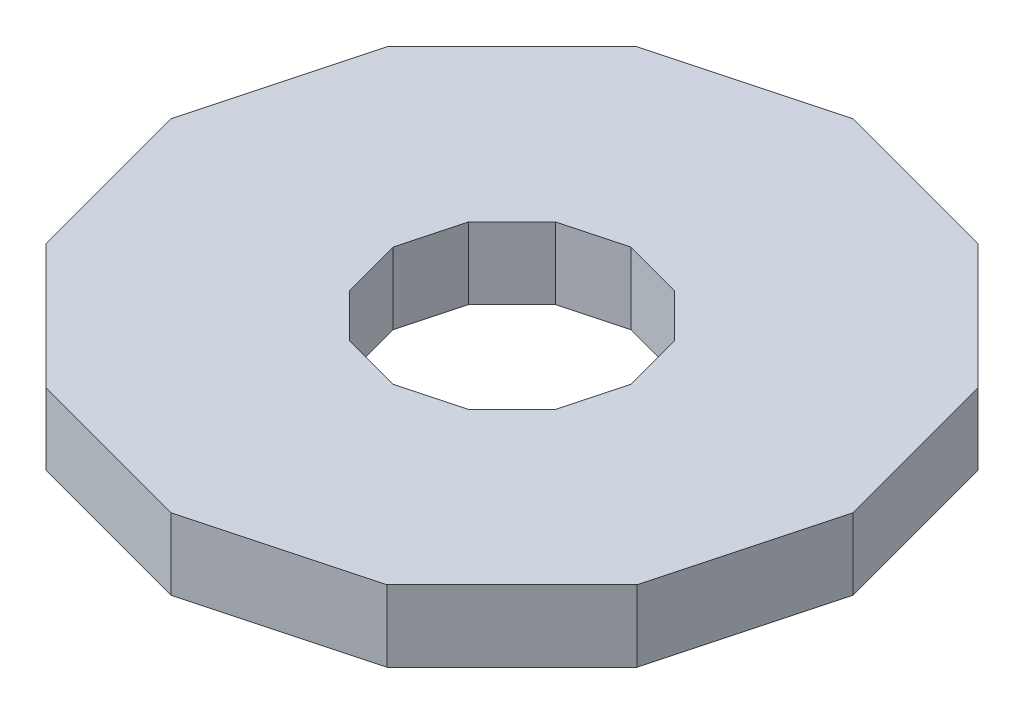
ISO-10303-21;
HEADER;
FILE_DESCRIPTION(('STEP AP214'),'2;1');
FILE_NAME('part.step','',(''),(''),'','','');
FILE_SCHEMA(('AUTOMOTIVE_DESIGN { 1 0 10303 214 1 1 1 1 }'));
ENDSEC;
DATA;
#1=APPLICATION_CONTEXT('core data for automotive mechanical design processes');
#2=APPLICATION_PROTOCOL_DEFINITION('international standard','automotive_design',2000,#1);
#3=PRODUCT_CONTEXT('',#1,'mechanical');
#4=PRODUCT('Part','Part','',(#3));
#5=PRODUCT_RELATED_PRODUCT_CATEGORY('part','',(#4));
#6=PRODUCT_DEFINITION_FORMATION('','',#4);
#7=PRODUCT_DEFINITION_CONTEXT('part definition',#1,'design');
#8=PRODUCT_DEFINITION('design','',#6,#7);
#9=PRODUCT_DEFINITION_SHAPE('','',#8);
#10=(LENGTH_UNIT() NAMED_UNIT(*) SI_UNIT(.MILLI.,.METRE.));
#11=(NAMED_UNIT(*) PLANE_ANGLE_UNIT() SI_UNIT($,.RADIAN.));
#12=(NAMED_UNIT(*) SI_UNIT($,.STERADIAN.) SOLID_ANGLE_UNIT());
#13=UNCERTAINTY_MEASURE_WITH_UNIT(LENGTH_MEASURE(1.E-05),#10,'distance_accuracy_value','');
#14=(GEOMETRIC_REPRESENTATION_CONTEXT(3) GLOBAL_UNCERTAINTY_ASSIGNED_CONTEXT((#13)) GLOBAL_UNIT_ASSIGNED_CONTEXT((#10,
#11,#12)) REPRESENTATION_CONTEXT('',''));
#15=CARTESIAN_POINT('',(0.,0.,0.));
#16=DIRECTION('',(0.,0.,1.));
#17=DIRECTION('',(1.,0.,0.));
#18=AXIS2_PLACEMENT_3D('',#15,#16,#17);
#19=CARTESIAN_POINT('',(0.,19.05,0.));
#20=DIRECTION('',(0.,1.,0.));
#21=DIRECTION('',(0.,0.,1.));
#22=AXIS2_PLACEMENT_3D('',#19,#20,#21);
#23=PLANE('',#22);
#24=DIRECTION('',(0.258819045102521,0.,-0.965925826289068));
#25=VECTOR('',#24,1.);
#26=CARTESIAN_POINT('',(78.6158022252792,19.05,45.3888545773233));
#27=LINE('',#26,#25);
#28=CARTESIAN_POINT('',(78.6158022252792,19.05,45.3888545773233));
#29=VERTEX_POINT('',#28);
#30=CARTESIAN_POINT('',(90.7777091546467,19.05,0.));
#31=VERTEX_POINT('',#30);
#32=EDGE_CURVE('E301',#29,#31,#27,.T.);
#33=ORIENTED_EDGE('',*,*,#32,.T.);
#34=DIRECTION('',(-0.258819045102521,0.,-0.965925826289068));
#35=VECTOR('',#34,1.);
#36=CARTESIAN_POINT('',(90.7777091546467,19.05,0.));
#37=LINE('',#36,#35);
#38=CARTESIAN_POINT('',(78.6158022252792,19.05,-45.3888545773234));
#39=VERTEX_POINT('',#38);
#40=EDGE_CURVE('E305',#31,#39,#37,.T.);
#41=ORIENTED_EDGE('',*,*,#40,.T.);
#42=DIRECTION('',(-0.707106781186548,0.,-0.707106781186547));
#43=VECTOR('',#42,1.);
#44=CARTESIAN_POINT('',(78.6158022252792,19.05,-45.3888545773234));
#45=LINE('',#44,#43);
#46=CARTESIAN_POINT('',(45.3888545773232,19.05,-78.6158022252793));
#47=VERTEX_POINT('',#46);
#48=EDGE_CURVE('E308',#39,#47,#45,.T.);
#49=ORIENTED_EDGE('',*,*,#48,.T.);
#50=DIRECTION('',(-0.965925826289068,0.,-0.25881904510252));
#51=VECTOR('',#50,1.);
#52=CARTESIAN_POINT('',(45.3888545773232,19.05,-78.6158022252793));
#53=LINE('',#52,#51);
#54=CARTESIAN_POINT('',(0.,19.05,-90.7777091546467));
#55=VERTEX_POINT('',#54);
#56=EDGE_CURVE('E310',#47,#55,#53,.T.);
#57=ORIENTED_EDGE('',*,*,#56,.T.);
#58=DIRECTION('',(-0.965925826289068,0.,0.258819045102521));
#59=VECTOR('',#58,1.);
#60=CARTESIAN_POINT('',(0.,19.05,-90.7777091546467));
#61=LINE('',#60,#59);
#62=CARTESIAN_POINT('',(-45.3888545773233,19.05,-78.6158022252792));
#63=VERTEX_POINT('',#62);
#64=EDGE_CURVE('E312',#55,#63,#61,.T.);
#65=ORIENTED_EDGE('',*,*,#64,.T.);
#66=DIRECTION('',(-0.707106781186547,0.,0.707106781186548));
#67=VECTOR('',#66,1.);
#68=CARTESIAN_POINT('',(-45.3888545773233,19.05,-78.6158022252792));
#69=LINE('',#68,#67);
#70=CARTESIAN_POINT('',(-78.6158022252792,19.05,-45.3888545773233));
#71=VERTEX_POINT('',#70);
#72=EDGE_CURVE('E314',#63,#71,#69,.T.);
#73=ORIENTED_EDGE('',*,*,#72,.T.);
#74=DIRECTION('',(-0.258819045102521,0.,0.965925826289068));
#75=VECTOR('',#74,1.);
#76=CARTESIAN_POINT('',(-78.6158022252792,19.05,-45.3888545773233));
#77=LINE('',#76,#75);
#78=CARTESIAN_POINT('',(-90.7777091546467,19.05,0.));
#79=VERTEX_POINT('',#78);
#80=EDGE_CURVE('E317',#71,#79,#77,.T.);
#81=ORIENTED_EDGE('',*,*,#80,.T.);
#82=DIRECTION('',(0.258819045102521,0.,0.965925826289068));
#83=VECTOR('',#82,1.);
#84=CARTESIAN_POINT('',(-90.7777091546467,19.05,0.));
#85=LINE('',#84,#83);
#86=CARTESIAN_POINT('',(-78.6158022252792,19.05,45.3888545773234));
#87=VERTEX_POINT('',#86);
#88=EDGE_CURVE('E320',#79,#87,#85,.T.);
#89=ORIENTED_EDGE('',*,*,#88,.T.);
#90=DIRECTION('',(0.707106781186548,0.,0.707106781186547));
#91=VECTOR('',#90,1.);
#92=CARTESIAN_POINT('',(-78.6158022252792,19.05,45.3888545773234));
#93=LINE('',#92,#91);
#94=CARTESIAN_POINT('',(-45.3888545773233,19.05,78.6158022252792));
#95=VERTEX_POINT('',#94);
#96=EDGE_CURVE('E322',#87,#95,#93,.T.);
#97=ORIENTED_EDGE('',*,*,#96,.T.);
#98=DIRECTION('',(0.965925826289068,0.,0.258819045102521));
#99=VECTOR('',#98,1.);
#100=CARTESIAN_POINT('',(-45.3888545773233,19.05,78.6158022252792));
#101=LINE('',#100,#99);
#102=CARTESIAN_POINT('',(0.,19.05,90.7777091546467));
#103=VERTEX_POINT('',#102);
#104=EDGE_CURVE('E325',#95,#103,#101,.T.);
#105=ORIENTED_EDGE('',*,*,#104,.T.);
#106=DIRECTION('',(0.965925826289068,0.,-0.258819045102521));
#107=VECTOR('',#106,1.);
#108=CARTESIAN_POINT('',(0.,19.05,90.7777091546467));
#109=LINE('',#108,#107);
#110=CARTESIAN_POINT('',(45.3888545773233,19.05,78.6158022252792));
#111=VERTEX_POINT('',#110);
#112=EDGE_CURVE('E327',#103,#111,#109,.T.);
#113=ORIENTED_EDGE('',*,*,#112,.T.);
#114=DIRECTION('',(0.707106781186547,0.,-0.707106781186548));
#115=VECTOR('',#114,1.);
#116=CARTESIAN_POINT('',(45.3888545773233,19.05,78.6158022252792));
#117=LINE('',#116,#115);
#118=EDGE_CURVE('E329',#111,#29,#117,.T.);
#119=ORIENTED_EDGE('',*,*,#118,.T.);
#120=EDGE_LOOP('',(#33,#41,#49,#57,#65,#73,#81,#89,#97,#105,#113,#119));
#121=FACE_BOUND('',#120,.T.);
#122=DIRECTION('',(-0.258819045102521,0.,-0.965925826289068));
#123=VECTOR('',#122,1.);
#124=CARTESIAN_POINT('',(31.6116754442104,19.05,0.));
#125=LINE('',#124,#123);
#126=CARTESIAN_POINT('',(31.6116754442104,19.05,0.));
#127=VERTEX_POINT('',#126);
#128=CARTESIAN_POINT('',(27.3765139908749,19.05,-15.8058377221052));
#129=VERTEX_POINT('',#128);
#130=EDGE_CURVE('E204',#127,#129,#125,.T.);
#131=ORIENTED_EDGE('',*,*,#130,.F.);
#132=DIRECTION('',(0.258819045102521,0.,-0.965925826289068));
#133=VECTOR('',#132,1.);
#134=CARTESIAN_POINT('',(27.3765139908749,19.05,15.8058377221052));
#135=LINE('',#134,#133);
#136=CARTESIAN_POINT('',(27.3765139908749,19.05,15.8058377221052));
#137=VERTEX_POINT('',#136);
#138=EDGE_CURVE('E195',#137,#127,#135,.T.);
#139=ORIENTED_EDGE('',*,*,#138,.F.);
#140=DIRECTION('',(0.707106781186547,0.,-0.707106781186548));
#141=VECTOR('',#140,1.);
#142=CARTESIAN_POINT('',(15.8058377221052,19.05,27.3765139908749));
#143=LINE('',#142,#141);
#144=CARTESIAN_POINT('',(15.8058377221052,19.05,27.3765139908749));
#145=VERTEX_POINT('',#144);
#146=EDGE_CURVE('E238',#145,#137,#143,.T.);
#147=ORIENTED_EDGE('',*,*,#146,.F.);
#148=DIRECTION('',(0.965925826289068,0.,-0.258819045102521));
#149=VECTOR('',#148,1.);
#150=CARTESIAN_POINT('',(0.,19.05,31.6116754442104));
#151=LINE('',#150,#149);
#152=CARTESIAN_POINT('',(0.,19.05,31.6116754442104));
#153=VERTEX_POINT('',#152);
#154=EDGE_CURVE('E236',#153,#145,#151,.T.);
#155=ORIENTED_EDGE('',*,*,#154,.F.);
#156=DIRECTION('',(0.965925826289069,0.,0.25881904510252));
#157=VECTOR('',#156,1.);
#158=CARTESIAN_POINT('',(-15.8058377221052,19.05,27.376513990875));
#159=LINE('',#158,#157);
#160=CARTESIAN_POINT('',(-15.8058377221052,19.05,27.376513990875));
#161=VERTEX_POINT('',#160);
#162=EDGE_CURVE('E234',#161,#153,#159,.T.);
#163=ORIENTED_EDGE('',*,*,#162,.F.);
#164=DIRECTION('',(0.707106781186548,0.,0.707106781186547));
#165=VECTOR('',#164,1.);
#166=CARTESIAN_POINT('',(-27.3765139908749,19.05,15.8058377221052));
#167=LINE('',#166,#165);
#168=CARTESIAN_POINT('',(-27.3765139908749,19.05,15.8058377221052));
#169=VERTEX_POINT('',#168);
#170=EDGE_CURVE('E232',#169,#161,#167,.T.);
#171=ORIENTED_EDGE('',*,*,#170,.F.);
#172=DIRECTION('',(0.258819045102521,0.,0.965925826289068));
#173=VECTOR('',#172,1.);
#174=CARTESIAN_POINT('',(-31.6116754442104,19.05,0.));
#175=LINE('',#174,#173);
#176=CARTESIAN_POINT('',(-31.6116754442104,19.05,0.));
#177=VERTEX_POINT('',#176);
#178=EDGE_CURVE('E230',#177,#169,#175,.T.);
#179=ORIENTED_EDGE('',*,*,#178,.F.);
#180=DIRECTION('',(-0.258819045102521,0.,0.965925826289068));
#181=VECTOR('',#180,1.);
#182=CARTESIAN_POINT('',(-27.376513990875,19.05,-15.8058377221052));
#183=LINE('',#182,#181);
#184=CARTESIAN_POINT('',(-27.376513990875,19.05,-15.8058377221052));
#185=VERTEX_POINT('',#184);
#186=EDGE_CURVE('E227',#185,#177,#183,.T.);
#187=ORIENTED_EDGE('',*,*,#186,.F.);
#188=DIRECTION('',(-0.707106781186547,0.,0.707106781186548));
#189=VECTOR('',#188,1.);
#190=CARTESIAN_POINT('',(-15.8058377221052,19.05,-27.3765139908749));
#191=LINE('',#190,#189);
#192=CARTESIAN_POINT('',(-15.8058377221052,19.05,-27.3765139908749));
#193=VERTEX_POINT('',#192);
#194=EDGE_CURVE('E225',#193,#185,#191,.T.);
#195=ORIENTED_EDGE('',*,*,#194,.F.);
#196=DIRECTION('',(-0.965925826289068,0.,0.258819045102521));
#197=VECTOR('',#196,1.);
#198=CARTESIAN_POINT('',(0.,19.05,-31.6116754442104));
#199=LINE('',#198,#197);
#200=CARTESIAN_POINT('',(0.,19.05,-31.6116754442104));
#201=VERTEX_POINT('',#200);
#202=EDGE_CURVE('E223',#201,#193,#199,.T.);
#203=ORIENTED_EDGE('',*,*,#202,.F.);
#204=DIRECTION('',(-0.965925826289068,0.,-0.25881904510252));
#205=VECTOR('',#204,1.);
#206=CARTESIAN_POINT('',(15.8058377221052,19.05,-27.376513990875));
#207=LINE('',#206,#205);
#208=CARTESIAN_POINT('',(15.8058377221052,19.05,-27.376513990875));
#209=VERTEX_POINT('',#208);
#210=EDGE_CURVE('E219',#209,#201,#207,.T.);
#211=ORIENTED_EDGE('',*,*,#210,.F.);
#212=DIRECTION('',(-0.707106781186548,0.,-0.707106781186547));
#213=VECTOR('',#212,1.);
#214=CARTESIAN_POINT('',(27.3765139908749,19.05,-15.8058377221052));
#215=LINE('',#214,#213);
#216=EDGE_CURVE('E217',#129,#209,#215,.T.);
#217=ORIENTED_EDGE('',*,*,#216,.F.);
#218=EDGE_LOOP('',(#131,#139,#147,#155,#163,#171,#179,#187,#195,#203,#211,#217));
#219=FACE_BOUND('',#218,.T.);
#220=ADVANCED_FACE('F34',(#121,#219),#23,.T.);
#221=CARTESIAN_POINT('',(0.,0.,0.));
#222=DIRECTION('',(0.,1.,0.));
#223=DIRECTION('',(0.,0.,1.));
#224=AXIS2_PLACEMENT_3D('',#221,#222,#223);
#225=PLANE('',#224);
#226=DIRECTION('',(0.258819045102521,0.,-0.965925826289068));
#227=VECTOR('',#226,1.);
#228=CARTESIAN_POINT('',(78.6158022252792,0.,45.3888545773233));
#229=LINE('',#228,#227);
#230=CARTESIAN_POINT('',(78.6158022252792,0.,45.3888545773233));
#231=VERTEX_POINT('',#230);
#232=CARTESIAN_POINT('',(90.7777091546467,0.,0.));
#233=VERTEX_POINT('',#232);
#234=EDGE_CURVE('E212',#231,#233,#229,.T.);
#235=ORIENTED_EDGE('',*,*,#234,.F.);
#236=DIRECTION('',(0.707106781186547,0.,-0.707106781186548));
#237=VECTOR('',#236,1.);
#238=CARTESIAN_POINT('',(45.3888545773233,0.,78.6158022252792));
#239=LINE('',#238,#237);
#240=CARTESIAN_POINT('',(45.3888545773233,0.,78.6158022252792));
#241=VERTEX_POINT('',#240);
#242=EDGE_CURVE('E306',#241,#231,#239,.T.);
#243=ORIENTED_EDGE('',*,*,#242,.F.);
#244=DIRECTION('',(0.965925826289068,0.,-0.258819045102521));
#245=VECTOR('',#244,1.);
#246=CARTESIAN_POINT('',(0.,0.,90.7777091546467));
#247=LINE('',#246,#245);
#248=CARTESIAN_POINT('',(0.,0.,90.7777091546467));
#249=VERTEX_POINT('',#248);
#250=EDGE_CURVE('E352',#249,#241,#247,.T.);
#251=ORIENTED_EDGE('',*,*,#250,.F.);
#252=DIRECTION('',(0.965925826289068,0.,0.258819045102521));
#253=VECTOR('',#252,1.);
#254=CARTESIAN_POINT('',(-45.3888545773233,0.,78.6158022252792));
#255=LINE('',#254,#253);
#256=CARTESIAN_POINT('',(-45.3888545773233,0.,78.6158022252792));
#257=VERTEX_POINT('',#256);
#258=EDGE_CURVE('E350',#257,#249,#255,.T.);
#259=ORIENTED_EDGE('',*,*,#258,.F.);
#260=DIRECTION('',(0.707106781186548,0.,0.707106781186547));
#261=VECTOR('',#260,1.);
#262=CARTESIAN_POINT('',(-78.6158022252792,0.,45.3888545773234));
#263=LINE('',#262,#261);
#264=CARTESIAN_POINT('',(-78.6158022252792,0.,45.3888545773234));
#265=VERTEX_POINT('',#264);
#266=EDGE_CURVE('E348',#265,#257,#263,.T.);
#267=ORIENTED_EDGE('',*,*,#266,.F.);
#268=DIRECTION('',(0.258819045102521,0.,0.965925826289068));
#269=VECTOR('',#268,1.);
#270=CARTESIAN_POINT('',(-90.7777091546467,0.,0.));
#271=LINE('',#270,#269);
#272=CARTESIAN_POINT('',(-90.7777091546467,0.,0.));
#273=VERTEX_POINT('',#272);
#274=EDGE_CURVE('E346',#273,#265,#271,.T.);
#275=ORIENTED_EDGE('',*,*,#274,.F.);
#276=DIRECTION('',(-0.258819045102521,0.,0.965925826289068));
#277=VECTOR('',#276,1.);
#278=CARTESIAN_POINT('',(-78.6158022252792,0.,-45.3888545773233));
#279=LINE('',#278,#277);
#280=CARTESIAN_POINT('',(-78.6158022252792,0.,-45.3888545773233));
#281=VERTEX_POINT('',#280);
#282=EDGE_CURVE('E344',#281,#273,#279,.T.);
#283=ORIENTED_EDGE('',*,*,#282,.F.);
#284=DIRECTION('',(-0.707106781186547,0.,0.707106781186548));
#285=VECTOR('',#284,1.);
#286=CARTESIAN_POINT('',(-45.3888545773233,0.,-78.6158022252792));
#287=LINE('',#286,#285);
#288=CARTESIAN_POINT('',(-45.3888545773233,0.,-78.6158022252792));
#289=VERTEX_POINT('',#288);
#290=EDGE_CURVE('E342',#289,#281,#287,.T.);
#291=ORIENTED_EDGE('',*,*,#290,.F.);
#292=DIRECTION('',(-0.965925826289068,0.,0.258819045102521));
#293=VECTOR('',#292,1.);
#294=CARTESIAN_POINT('',(0.,0.,-90.7777091546467));
#295=LINE('',#294,#293);
#296=CARTESIAN_POINT('',(0.,0.,-90.7777091546467));
#297=VERTEX_POINT('',#296);
#298=EDGE_CURVE('E340',#297,#289,#295,.T.);
#299=ORIENTED_EDGE('',*,*,#298,.F.);
#300=DIRECTION('',(-0.965925826289068,0.,-0.25881904510252));
#301=VECTOR('',#300,1.);
#302=CARTESIAN_POINT('',(45.3888545773232,0.,-78.6158022252793));
#303=LINE('',#302,#301);
#304=CARTESIAN_POINT('',(45.3888545773232,0.,-78.6158022252793));
#305=VERTEX_POINT('',#304);
#306=EDGE_CURVE('E338',#305,#297,#303,.T.);
#307=ORIENTED_EDGE('',*,*,#306,.F.);
#308=DIRECTION('',(-0.707106781186548,0.,-0.707106781186547));
#309=VECTOR('',#308,1.);
#310=CARTESIAN_POINT('',(78.6158022252792,0.,-45.3888545773234));
#311=LINE('',#310,#309);
#312=CARTESIAN_POINT('',(78.6158022252792,0.,-45.3888545773234));
#313=VERTEX_POINT('',#312);
#314=EDGE_CURVE('E336',#313,#305,#311,.T.);
#315=ORIENTED_EDGE('',*,*,#314,.F.);
#316=DIRECTION('',(-0.258819045102521,0.,-0.965925826289068));
#317=VECTOR('',#316,1.);
#318=CARTESIAN_POINT('',(90.7777091546467,0.,0.));
#319=LINE('',#318,#317);
#320=EDGE_CURVE('E334',#233,#313,#319,.T.);
#321=ORIENTED_EDGE('',*,*,#320,.F.);
#322=EDGE_LOOP('',(#235,#243,#251,#259,#267,#275,#283,#291,#299,#307,#315,#321));
#323=FACE_BOUND('',#322,.T.);
#324=DIRECTION('',(0.258819045102521,0.,-0.965925826289068));
#325=VECTOR('',#324,1.);
#326=CARTESIAN_POINT('',(27.3765139908749,0.,15.8058377221052));
#327=LINE('',#326,#325);
#328=CARTESIAN_POINT('',(27.3765139908749,0.,15.8058377221052));
#329=VERTEX_POINT('',#328);
#330=CARTESIAN_POINT('',(31.6116754442104,0.,0.));
#331=VERTEX_POINT('',#330);
#332=EDGE_CURVE('E57',#329,#331,#327,.T.);
#333=ORIENTED_EDGE('',*,*,#332,.T.);
#334=DIRECTION('',(-0.258819045102521,0.,-0.965925826289068));
#335=VECTOR('',#334,1.);
#336=CARTESIAN_POINT('',(31.6116754442104,0.,0.));
#337=LINE('',#336,#335);
#338=CARTESIAN_POINT('',(27.3765139908749,0.,-15.8058377221052));
#339=VERTEX_POINT('',#338);
#340=EDGE_CURVE('E211',#331,#339,#337,.T.);
#341=ORIENTED_EDGE('',*,*,#340,.T.);
#342=DIRECTION('',(-0.707106781186548,0.,-0.707106781186547));
#343=VECTOR('',#342,1.);
#344=CARTESIAN_POINT('',(27.3765139908749,0.,-15.8058377221052));
#345=LINE('',#344,#343);
#346=CARTESIAN_POINT('',(15.8058377221052,0.,-27.376513990875));
#347=VERTEX_POINT('',#346);
#348=EDGE_CURVE('E244',#339,#347,#345,.T.);
#349=ORIENTED_EDGE('',*,*,#348,.T.);
#350=DIRECTION('',(-0.965925826289068,0.,-0.25881904510252));
#351=VECTOR('',#350,1.);
#352=CARTESIAN_POINT('',(15.8058377221052,0.,-27.376513990875));
#353=LINE('',#352,#351);
#354=CARTESIAN_POINT('',(0.,0.,-31.6116754442104));
#355=VERTEX_POINT('',#354);
#356=EDGE_CURVE('E248',#347,#355,#353,.T.);
#357=ORIENTED_EDGE('',*,*,#356,.T.);
#358=DIRECTION('',(-0.965925826289068,0.,0.258819045102521));
#359=VECTOR('',#358,1.);
#360=CARTESIAN_POINT('',(0.,0.,-31.6116754442104));
#361=LINE('',#360,#359);
#362=CARTESIAN_POINT('',(-15.8058377221052,0.,-27.3765139908749));
#363=VERTEX_POINT('',#362);
#364=EDGE_CURVE('E252',#355,#363,#361,.T.);
#365=ORIENTED_EDGE('',*,*,#364,.T.);
#366=DIRECTION('',(-0.707106781186547,0.,0.707106781186548));
#367=VECTOR('',#366,1.);
#368=CARTESIAN_POINT('',(-15.8058377221052,0.,-27.3765139908749));
#369=LINE('',#368,#367);
#370=CARTESIAN_POINT('',(-27.376513990875,0.,-15.8058377221052));
#371=VERTEX_POINT('',#370);
#372=EDGE_CURVE('E256',#363,#371,#369,.T.);
#373=ORIENTED_EDGE('',*,*,#372,.T.);
#374=DIRECTION('',(-0.258819045102521,0.,0.965925826289068));
#375=VECTOR('',#374,1.);
#376=CARTESIAN_POINT('',(-27.376513990875,0.,-15.8058377221052));
#377=LINE('',#376,#375);
#378=CARTESIAN_POINT('',(-31.6116754442104,0.,0.));
#379=VERTEX_POINT('',#378);
#380=EDGE_CURVE('E260',#371,#379,#377,.T.);
#381=ORIENTED_EDGE('',*,*,#380,.T.);
#382=DIRECTION('',(0.258819045102521,0.,0.965925826289068));
#383=VECTOR('',#382,1.);
#384=CARTESIAN_POINT('',(-31.6116754442104,0.,0.));
#385=LINE('',#384,#383);
#386=CARTESIAN_POINT('',(-27.3765139908749,0.,15.8058377221052));
#387=VERTEX_POINT('',#386);
#388=EDGE_CURVE('E264',#379,#387,#385,.T.);
#389=ORIENTED_EDGE('',*,*,#388,.T.);
#390=DIRECTION('',(0.707106781186548,0.,0.707106781186547));
#391=VECTOR('',#390,1.);
#392=CARTESIAN_POINT('',(-27.3765139908749,0.,15.8058377221052));
#393=LINE('',#392,#391);
#394=CARTESIAN_POINT('',(-15.8058377221052,0.,27.376513990875));
#395=VERTEX_POINT('',#394);
#396=EDGE_CURVE('E267',#387,#395,#393,.T.);
#397=ORIENTED_EDGE('',*,*,#396,.T.);
#398=DIRECTION('',(0.965925826289069,0.,0.25881904510252));
#399=VECTOR('',#398,1.);
#400=CARTESIAN_POINT('',(-15.8058377221052,0.,27.376513990875));
#401=LINE('',#400,#399);
#402=CARTESIAN_POINT('',(0.,0.,31.6116754442104));
#403=VERTEX_POINT('',#402);
#404=EDGE_CURVE('E270',#395,#403,#401,.T.);
#405=ORIENTED_EDGE('',*,*,#404,.T.);
#406=DIRECTION('',(0.965925826289068,0.,-0.258819045102521));
#407=VECTOR('',#406,1.);
#408=CARTESIAN_POINT('',(0.,0.,31.6116754442104));
#409=LINE('',#408,#407);
#410=CARTESIAN_POINT('',(15.8058377221052,0.,27.3765139908749));
#411=VERTEX_POINT('',#410);
#412=EDGE_CURVE('E273',#403,#411,#409,.T.);
#413=ORIENTED_EDGE('',*,*,#412,.T.);
#414=DIRECTION('',(0.707106781186547,0.,-0.707106781186548));
#415=VECTOR('',#414,1.);
#416=CARTESIAN_POINT('',(15.8058377221052,0.,27.3765139908749));
#417=LINE('',#416,#415);
#418=EDGE_CURVE('E205',#411,#329,#417,.T.);
#419=ORIENTED_EDGE('',*,*,#418,.T.);
#420=EDGE_LOOP('',(#333,#341,#349,#357,#365,#373,#381,#389,#397,#405,#413,#419));
#421=FACE_BOUND('',#420,.T.);
#422=ADVANCED_FACE('F396',(#323,#421),#225,.F.);
#423=CARTESIAN_POINT('',(78.6158022252792,19.05,45.3888545773233));
#424=DIRECTION('',(-0.965925826289068,0.,-0.258819045102521));
#425=DIRECTION('',(-0.258819045102521,0.,0.965925826289068));
#426=AXIS2_PLACEMENT_3D('',#423,#424,#425);
#427=PLANE('',#426);
#428=ORIENTED_EDGE('',*,*,#234,.T.);
#429=DIRECTION('',(0.,-1.,0.));
#430=VECTOR('',#429,1.);
#431=CARTESIAN_POINT('',(90.7777091546467,19.05,0.));
#432=LINE('',#431,#430);
#433=EDGE_CURVE('E11',#31,#233,#432,.T.);
#434=ORIENTED_EDGE('',*,*,#433,.F.);
#435=ORIENTED_EDGE('',*,*,#32,.F.);
#436=DIRECTION('',(0.,-1.,0.));
#437=VECTOR('',#436,1.);
#438=CARTESIAN_POINT('',(78.6158022252792,19.05,45.3888545773233));
#439=LINE('',#438,#437);
#440=EDGE_CURVE('E331',#29,#231,#439,.T.);
#441=ORIENTED_EDGE('',*,*,#440,.T.);
#442=EDGE_LOOP('',(#428,#434,#435,#441));
#443=FACE_BOUND('',#442,.T.);
#444=ADVANCED_FACE('F36',(#443),#427,.F.);
#445=CARTESIAN_POINT('',(90.7777091546467,19.05,0.));
#446=DIRECTION('',(-0.965925826289068,0.,0.258819045102521));
#447=DIRECTION('',(0.258819045102521,0.,0.965925826289068));
#448=AXIS2_PLACEMENT_3D('',#445,#446,#447);
#449=PLANE('',#448);
#450=ORIENTED_EDGE('',*,*,#320,.T.);
#451=DIRECTION('',(0.,-1.,0.));
#452=VECTOR('',#451,1.);
#453=CARTESIAN_POINT('',(78.6158022252792,19.05,-45.3888545773234));
#454=LINE('',#453,#452);
#455=EDGE_CURVE('E42',#39,#313,#454,.T.);
#456=ORIENTED_EDGE('',*,*,#455,.F.);
#457=ORIENTED_EDGE('',*,*,#40,.F.);
#458=ORIENTED_EDGE('',*,*,#433,.T.);
#459=EDGE_LOOP('',(#450,#456,#457,#458));
#460=FACE_BOUND('',#459,.T.);
#461=ADVANCED_FACE('F413',(#460),#449,.F.);
#462=CARTESIAN_POINT('',(78.6158022252792,19.05,-45.3888545773234));
#463=DIRECTION('',(-0.707106781186547,0.,0.707106781186548));
#464=DIRECTION('',(0.707106781186548,0.,0.707106781186547));
#465=AXIS2_PLACEMENT_3D('',#462,#463,#464);
#466=PLANE('',#465);
#467=ORIENTED_EDGE('',*,*,#314,.T.);
#468=DIRECTION('',(0.,-1.,0.));
#469=VECTOR('',#468,1.);
#470=CARTESIAN_POINT('',(45.3888545773232,19.05,-78.6158022252793));
#471=LINE('',#470,#469);
#472=EDGE_CURVE('E381',#47,#305,#471,.T.);
#473=ORIENTED_EDGE('',*,*,#472,.F.);
#474=ORIENTED_EDGE('',*,*,#48,.F.);
#475=ORIENTED_EDGE('',*,*,#455,.T.);
#476=EDGE_LOOP('',(#467,#473,#474,#475));
#477=FACE_BOUND('',#476,.T.);
#478=ADVANCED_FACE('F390',(#477),#466,.F.);
#479=CARTESIAN_POINT('',(45.3888545773232,19.05,-78.6158022252793));
#480=DIRECTION('',(-0.25881904510252,0.,0.965925826289068));
#481=DIRECTION('',(0.965925826289069,0.,0.25881904510252));
#482=AXIS2_PLACEMENT_3D('',#479,#480,#481);
#483=PLANE('',#482);
#484=ORIENTED_EDGE('',*,*,#306,.T.);
#485=DIRECTION('',(0.,-1.,0.));
#486=VECTOR('',#485,1.);
#487=CARTESIAN_POINT('',(0.,19.05,-90.7777091546467));
#488=LINE('',#487,#486);
#489=EDGE_CURVE('E378',#55,#297,#488,.T.);
#490=ORIENTED_EDGE('',*,*,#489,.F.);
#491=ORIENTED_EDGE('',*,*,#56,.F.);
#492=ORIENTED_EDGE('',*,*,#472,.T.);
#493=EDGE_LOOP('',(#484,#490,#491,#492));
#494=FACE_BOUND('',#493,.T.);
#495=ADVANCED_FACE('F402',(#494),#483,.F.);
#496=CARTESIAN_POINT('',(0.,19.05,-90.7777091546467));
#497=DIRECTION('',(0.258819045102521,0.,0.965925826289068));
#498=DIRECTION('',(0.965925826289068,0.,-0.258819045102521));
#499=AXIS2_PLACEMENT_3D('',#496,#497,#498);
#500=PLANE('',#499);
#501=ORIENTED_EDGE('',*,*,#298,.T.);
#502=DIRECTION('',(0.,-1.,0.));
#503=VECTOR('',#502,1.);
#504=CARTESIAN_POINT('',(-45.3888545773233,19.05,-78.6158022252792));
#505=LINE('',#504,#503);
#506=EDGE_CURVE('E375',#63,#289,#505,.T.);
#507=ORIENTED_EDGE('',*,*,#506,.F.);
#508=ORIENTED_EDGE('',*,*,#64,.F.);
#509=ORIENTED_EDGE('',*,*,#489,.T.);
#510=EDGE_LOOP('',(#501,#507,#508,#509));
#511=FACE_BOUND('',#510,.T.);
#512=ADVANCED_FACE('F406',(#511),#500,.F.);
#513=CARTESIAN_POINT('',(-45.3888545773233,19.05,-78.6158022252792));
#514=DIRECTION('',(0.707106781186548,0.,0.707106781186547));
#515=DIRECTION('',(0.707106781186547,0.,-0.707106781186548));
#516=AXIS2_PLACEMENT_3D('',#513,#514,#515);
#517=PLANE('',#516);
#518=ORIENTED_EDGE('',*,*,#290,.T.);
#519=DIRECTION('',(0.,-1.,0.));
#520=VECTOR('',#519,1.);
#521=CARTESIAN_POINT('',(-78.6158022252792,19.05,-45.3888545773233));
#522=LINE('',#521,#520);
#523=EDGE_CURVE('E372',#71,#281,#522,.T.);
#524=ORIENTED_EDGE('',*,*,#523,.F.);
#525=ORIENTED_EDGE('',*,*,#72,.F.);
#526=ORIENTED_EDGE('',*,*,#506,.T.);
#527=EDGE_LOOP('',(#518,#524,#525,#526));
#528=FACE_BOUND('',#527,.T.);
#529=ADVANCED_FACE('F446',(#528),#517,.F.);
#530=CARTESIAN_POINT('',(-78.6158022252792,19.05,-45.3888545773233));
#531=DIRECTION('',(0.965925826289068,0.,0.258819045102521));
#532=DIRECTION('',(0.258819045102521,0.,-0.965925826289068));
#533=AXIS2_PLACEMENT_3D('',#530,#531,#532);
#534=PLANE('',#533);
#535=ORIENTED_EDGE('',*,*,#282,.T.);
#536=DIRECTION('',(0.,-1.,0.));
#537=VECTOR('',#536,1.);
#538=CARTESIAN_POINT('',(-90.7777091546467,19.05,0.));
#539=LINE('',#538,#537);
#540=EDGE_CURVE('E369',#79,#273,#539,.T.);
#541=ORIENTED_EDGE('',*,*,#540,.F.);
#542=ORIENTED_EDGE('',*,*,#80,.F.);
#543=ORIENTED_EDGE('',*,*,#523,.T.);
#544=EDGE_LOOP('',(#535,#541,#542,#543));
#545=FACE_BOUND('',#544,.T.);
#546=ADVANCED_FACE('F444',(#545),#534,.F.);
#547=CARTESIAN_POINT('',(-90.7777091546467,19.05,0.));
#548=DIRECTION('',(0.965925826289068,0.,-0.258819045102521));
#549=DIRECTION('',(-0.258819045102521,0.,-0.965925826289068));
#550=AXIS2_PLACEMENT_3D('',#547,#548,#549);
#551=PLANE('',#550);
#552=ORIENTED_EDGE('',*,*,#274,.T.);
#553=DIRECTION('',(0.,-1.,0.));
#554=VECTOR('',#553,1.);
#555=CARTESIAN_POINT('',(-78.6158022252792,19.05,45.3888545773234));
#556=LINE('',#555,#554);
#557=EDGE_CURVE('E366',#87,#265,#556,.T.);
#558=ORIENTED_EDGE('',*,*,#557,.F.);
#559=ORIENTED_EDGE('',*,*,#88,.F.);
#560=ORIENTED_EDGE('',*,*,#540,.T.);
#561=EDGE_LOOP('',(#552,#558,#559,#560));
#562=FACE_BOUND('',#561,.T.);
#563=ADVANCED_FACE('F440',(#562),#551,.F.);
#564=CARTESIAN_POINT('',(-78.6158022252792,19.05,45.3888545773234));
#565=DIRECTION('',(0.707106781186547,0.,-0.707106781186548));
#566=DIRECTION('',(-0.707106781186548,0.,-0.707106781186547));
#567=AXIS2_PLACEMENT_3D('',#564,#565,#566);
#568=PLANE('',#567);
#569=ORIENTED_EDGE('',*,*,#266,.T.);
#570=DIRECTION('',(0.,-1.,0.));
#571=VECTOR('',#570,1.);
#572=CARTESIAN_POINT('',(-45.3888545773233,19.05,78.6158022252792));
#573=LINE('',#572,#571);
#574=EDGE_CURVE('E363',#95,#257,#573,.T.);
#575=ORIENTED_EDGE('',*,*,#574,.F.);
#576=ORIENTED_EDGE('',*,*,#96,.F.);
#577=ORIENTED_EDGE('',*,*,#557,.T.);
#578=EDGE_LOOP('',(#569,#575,#576,#577));
#579=FACE_BOUND('',#578,.T.);
#580=ADVANCED_FACE('F435',(#579),#568,.F.);
#581=CARTESIAN_POINT('',(-45.3888545773233,19.05,78.6158022252792));
#582=DIRECTION('',(0.258819045102521,0.,-0.965925826289068));
#583=DIRECTION('',(-0.965925826289068,0.,-0.258819045102521));
#584=AXIS2_PLACEMENT_3D('',#581,#582,#583);
#585=PLANE('',#584);
#586=ORIENTED_EDGE('',*,*,#258,.T.);
#587=DIRECTION('',(0.,-1.,0.));
#588=VECTOR('',#587,1.);
#589=CARTESIAN_POINT('',(0.,19.05,90.7777091546467));
#590=LINE('',#589,#588);
#591=EDGE_CURVE('E360',#103,#249,#590,.T.);
#592=ORIENTED_EDGE('',*,*,#591,.F.);
#593=ORIENTED_EDGE('',*,*,#104,.F.);
#594=ORIENTED_EDGE('',*,*,#574,.T.);
#595=EDGE_LOOP('',(#586,#592,#593,#594));
#596=FACE_BOUND('',#595,.T.);
#597=ADVANCED_FACE('F429',(#596),#585,.F.);
#598=CARTESIAN_POINT('',(0.,19.05,90.7777091546467));
#599=DIRECTION('',(-0.258819045102521,0.,-0.965925826289068));
#600=DIRECTION('',(-0.965925826289068,0.,0.258819045102521));
#601=AXIS2_PLACEMENT_3D('',#598,#599,#600);
#602=PLANE('',#601);
#603=ORIENTED_EDGE('',*,*,#250,.T.);
#604=DIRECTION('',(0.,-1.,0.));
#605=VECTOR('',#604,1.);
#606=CARTESIAN_POINT('',(45.3888545773233,19.05,78.6158022252792));
#607=LINE('',#606,#605);
#608=EDGE_CURVE('E357',#111,#241,#607,.T.);
#609=ORIENTED_EDGE('',*,*,#608,.F.);
#610=ORIENTED_EDGE('',*,*,#112,.F.);
#611=ORIENTED_EDGE('',*,*,#591,.T.);
#612=EDGE_LOOP('',(#603,#609,#610,#611));
#613=FACE_BOUND('',#612,.T.);
#614=ADVANCED_FACE('F425',(#613),#602,.F.);
#615=CARTESIAN_POINT('',(45.3888545773233,19.05,78.6158022252792));
#616=DIRECTION('',(-0.707106781186548,0.,-0.707106781186547));
#617=DIRECTION('',(-0.707106781186547,0.,0.707106781186548));
#618=AXIS2_PLACEMENT_3D('',#615,#616,#617);
#619=PLANE('',#618);
#620=ORIENTED_EDGE('',*,*,#242,.T.);
#621=ORIENTED_EDGE('',*,*,#440,.F.);
#622=ORIENTED_EDGE('',*,*,#118,.F.);
#623=ORIENTED_EDGE('',*,*,#608,.T.);
#624=EDGE_LOOP('',(#620,#621,#622,#623));
#625=FACE_BOUND('',#624,.T.);
#626=ADVANCED_FACE('F420',(#625),#619,.F.);
#627=CARTESIAN_POINT('',(27.3765139908749,19.05,15.8058377221052));
#628=DIRECTION('',(-0.965925826289068,0.,-0.258819045102521));
#629=DIRECTION('',(-0.258819045102521,0.,0.965925826289068));
#630=AXIS2_PLACEMENT_3D('',#627,#628,#629);
#631=PLANE('',#630);
#632=ORIENTED_EDGE('',*,*,#332,.F.);
#633=DIRECTION('',(0.,-1.,0.));
#634=VECTOR('',#633,1.);
#635=CARTESIAN_POINT('',(27.3765139908749,19.05,15.8058377221052));
#636=LINE('',#635,#634);
#637=EDGE_CURVE('E199',#137,#329,#636,.T.);
#638=ORIENTED_EDGE('',*,*,#637,.F.);
#639=ORIENTED_EDGE('',*,*,#138,.T.);
#640=DIRECTION('',(0.,-1.,0.));
#641=VECTOR('',#640,1.);
#642=CARTESIAN_POINT('',(31.6116754442104,19.05,0.));
#643=LINE('',#642,#641);
#644=EDGE_CURVE('E198',#127,#331,#643,.T.);
#645=ORIENTED_EDGE('',*,*,#644,.T.);
#646=EDGE_LOOP('',(#632,#638,#639,#645));
#647=FACE_BOUND('',#646,.T.);
#648=ADVANCED_FACE('F197',(#647),#631,.T.);
#649=CARTESIAN_POINT('',(31.6116754442104,19.05,0.));
#650=DIRECTION('',(-0.965925826289068,0.,0.258819045102521));
#651=DIRECTION('',(0.258819045102521,0.,0.965925826289068));
#652=AXIS2_PLACEMENT_3D('',#649,#650,#651);
#653=PLANE('',#652);
#654=ORIENTED_EDGE('',*,*,#340,.F.);
#655=ORIENTED_EDGE('',*,*,#644,.F.);
#656=ORIENTED_EDGE('',*,*,#130,.T.);
#657=DIRECTION('',(0.,-1.,0.));
#658=VECTOR('',#657,1.);
#659=CARTESIAN_POINT('',(27.3765139908749,19.05,-15.8058377221052));
#660=LINE('',#659,#658);
#661=EDGE_CURVE('E213',#129,#339,#660,.T.);
#662=ORIENTED_EDGE('',*,*,#661,.T.);
#663=EDGE_LOOP('',(#654,#655,#656,#662));
#664=FACE_BOUND('',#663,.T.);
#665=ADVANCED_FACE('F208',(#664),#653,.T.);
#666=CARTESIAN_POINT('',(27.3765139908749,19.05,-15.8058377221052));
#667=DIRECTION('',(-0.707106781186547,0.,0.707106781186548));
#668=DIRECTION('',(0.707106781186548,0.,0.707106781186547));
#669=AXIS2_PLACEMENT_3D('',#666,#667,#668);
#670=PLANE('',#669);
#671=ORIENTED_EDGE('',*,*,#348,.F.);
#672=ORIENTED_EDGE('',*,*,#661,.F.);
#673=ORIENTED_EDGE('',*,*,#216,.T.);
#674=DIRECTION('',(0.,-1.,0.));
#675=VECTOR('',#674,1.);
#676=CARTESIAN_POINT('',(15.8058377221052,19.05,-27.376513990875));
#677=LINE('',#676,#675);
#678=EDGE_CURVE('E297',#209,#347,#677,.T.);
#679=ORIENTED_EDGE('',*,*,#678,.T.);
#680=EDGE_LOOP('',(#671,#672,#673,#679));
#681=FACE_BOUND('',#680,.T.);
#682=ADVANCED_FACE('F504',(#681),#670,.T.);
#683=CARTESIAN_POINT('',(15.8058377221052,19.05,-27.376513990875));
#684=DIRECTION('',(-0.25881904510252,0.,0.965925826289068));
#685=DIRECTION('',(0.965925826289069,0.,0.25881904510252));
#686=AXIS2_PLACEMENT_3D('',#683,#684,#685);
#687=PLANE('',#686);
#688=ORIENTED_EDGE('',*,*,#356,.F.);
#689=ORIENTED_EDGE('',*,*,#678,.F.);
#690=ORIENTED_EDGE('',*,*,#210,.T.);
#691=DIRECTION('',(0.,-1.,0.));
#692=VECTOR('',#691,1.);
#693=CARTESIAN_POINT('',(0.,19.05,-31.6116754442104));
#694=LINE('',#693,#692);
#695=EDGE_CURVE('E294',#201,#355,#694,.T.);
#696=ORIENTED_EDGE('',*,*,#695,.T.);
#697=EDGE_LOOP('',(#688,#689,#690,#696));
#698=FACE_BOUND('',#697,.T.);
#699=ADVANCED_FACE('F510',(#698),#687,.T.);
#700=CARTESIAN_POINT('',(0.,19.05,-31.6116754442104));
#701=DIRECTION('',(0.258819045102521,0.,0.965925826289068));
#702=DIRECTION('',(0.965925826289068,0.,-0.258819045102521));
#703=AXIS2_PLACEMENT_3D('',#700,#701,#702);
#704=PLANE('',#703);
#705=ORIENTED_EDGE('',*,*,#364,.F.);
#706=ORIENTED_EDGE('',*,*,#695,.F.);
#707=ORIENTED_EDGE('',*,*,#202,.T.);
#708=DIRECTION('',(0.,-1.,0.));
#709=VECTOR('',#708,1.);
#710=CARTESIAN_POINT('',(-15.8058377221052,19.05,-27.3765139908749));
#711=LINE('',#710,#709);
#712=EDGE_CURVE('E291',#193,#363,#711,.T.);
#713=ORIENTED_EDGE('',*,*,#712,.T.);
#714=EDGE_LOOP('',(#705,#706,#707,#713));
#715=FACE_BOUND('',#714,.T.);
#716=ADVANCED_FACE('F518',(#715),#704,.T.);
#717=CARTESIAN_POINT('',(-15.8058377221052,19.05,-27.3765139908749));
#718=DIRECTION('',(0.707106781186548,0.,0.707106781186547));
#719=DIRECTION('',(0.707106781186547,0.,-0.707106781186548));
#720=AXIS2_PLACEMENT_3D('',#717,#718,#719);
#721=PLANE('',#720);
#722=ORIENTED_EDGE('',*,*,#372,.F.);
#723=ORIENTED_EDGE('',*,*,#712,.F.);
#724=ORIENTED_EDGE('',*,*,#194,.T.);
#725=DIRECTION('',(0.,-1.,0.));
#726=VECTOR('',#725,1.);
#727=CARTESIAN_POINT('',(-27.376513990875,19.05,-15.8058377221052));
#728=LINE('',#727,#726);
#729=EDGE_CURVE('E289',#185,#371,#728,.T.);
#730=ORIENTED_EDGE('',*,*,#729,.T.);
#731=EDGE_LOOP('',(#722,#723,#724,#730));
#732=FACE_BOUND('',#731,.T.);
#733=ADVANCED_FACE('F526',(#732),#721,.T.);
#734=CARTESIAN_POINT('',(-27.376513990875,19.05,-15.8058377221052));
#735=DIRECTION('',(0.965925826289068,0.,0.258819045102521));
#736=DIRECTION('',(0.258819045102521,0.,-0.965925826289068));
#737=AXIS2_PLACEMENT_3D('',#734,#735,#736);
#738=PLANE('',#737);
#739=ORIENTED_EDGE('',*,*,#380,.F.);
#740=ORIENTED_EDGE('',*,*,#729,.F.);
#741=ORIENTED_EDGE('',*,*,#186,.T.);
#742=DIRECTION('',(0.,-1.,0.));
#743=VECTOR('',#742,1.);
#744=CARTESIAN_POINT('',(-31.6116754442104,19.05,0.));
#745=LINE('',#744,#743);
#746=EDGE_CURVE('E287',#177,#379,#745,.T.);
#747=ORIENTED_EDGE('',*,*,#746,.T.);
#748=EDGE_LOOP('',(#739,#740,#741,#747));
#749=FACE_BOUND('',#748,.T.);
#750=ADVANCED_FACE('F534',(#749),#738,.T.);
#751=CARTESIAN_POINT('',(-31.6116754442104,19.05,0.));
#752=DIRECTION('',(0.965925826289068,0.,-0.258819045102521));
#753=DIRECTION('',(-0.258819045102521,0.,-0.965925826289068));
#754=AXIS2_PLACEMENT_3D('',#751,#752,#753);
#755=PLANE('',#754);
#756=ORIENTED_EDGE('',*,*,#388,.F.);
#757=ORIENTED_EDGE('',*,*,#746,.F.);
#758=ORIENTED_EDGE('',*,*,#178,.T.);
#759=DIRECTION('',(0.,-1.,0.));
#760=VECTOR('',#759,1.);
#761=CARTESIAN_POINT('',(-27.3765139908749,19.05,15.8058377221052));
#762=LINE('',#761,#760);
#763=EDGE_CURVE('E285',#169,#387,#762,.T.);
#764=ORIENTED_EDGE('',*,*,#763,.T.);
#765=EDGE_LOOP('',(#756,#757,#758,#764));
#766=FACE_BOUND('',#765,.T.);
#767=ADVANCED_FACE('F542',(#766),#755,.T.);
#768=CARTESIAN_POINT('',(-27.3765139908749,19.05,15.8058377221052));
#769=DIRECTION('',(0.707106781186547,0.,-0.707106781186548));
#770=DIRECTION('',(-0.707106781186548,0.,-0.707106781186547));
#771=AXIS2_PLACEMENT_3D('',#768,#769,#770);
#772=PLANE('',#771);
#773=ORIENTED_EDGE('',*,*,#396,.F.);
#774=ORIENTED_EDGE('',*,*,#763,.F.);
#775=ORIENTED_EDGE('',*,*,#170,.T.);
#776=DIRECTION('',(0.,-1.,0.));
#777=VECTOR('',#776,1.);
#778=CARTESIAN_POINT('',(-15.8058377221052,19.05,27.376513990875));
#779=LINE('',#778,#777);
#780=EDGE_CURVE('E283',#161,#395,#779,.T.);
#781=ORIENTED_EDGE('',*,*,#780,.T.);
#782=EDGE_LOOP('',(#773,#774,#775,#781));
#783=FACE_BOUND('',#782,.T.);
#784=ADVANCED_FACE('F550',(#783),#772,.T.);
#785=CARTESIAN_POINT('',(-15.8058377221052,19.05,27.376513990875));
#786=DIRECTION('',(0.25881904510252,0.,-0.965925826289068));
#787=DIRECTION('',(-0.965925826289068,0.,-0.25881904510252));
#788=AXIS2_PLACEMENT_3D('',#785,#786,#787);
#789=PLANE('',#788);
#790=ORIENTED_EDGE('',*,*,#404,.F.);
#791=ORIENTED_EDGE('',*,*,#780,.F.);
#792=ORIENTED_EDGE('',*,*,#162,.T.);
#793=DIRECTION('',(0.,-1.,0.));
#794=VECTOR('',#793,1.);
#795=CARTESIAN_POINT('',(0.,19.05,31.6116754442104));
#796=LINE('',#795,#794);
#797=EDGE_CURVE('E281',#153,#403,#796,.T.);
#798=ORIENTED_EDGE('',*,*,#797,.T.);
#799=EDGE_LOOP('',(#790,#791,#792,#798));
#800=FACE_BOUND('',#799,.T.);
#801=ADVANCED_FACE('F558',(#800),#789,.T.);
#802=CARTESIAN_POINT('',(0.,19.05,31.6116754442104));
#803=DIRECTION('',(-0.258819045102521,0.,-0.965925826289068));
#804=DIRECTION('',(-0.965925826289068,0.,0.258819045102521));
#805=AXIS2_PLACEMENT_3D('',#802,#803,#804);
#806=PLANE('',#805);
#807=ORIENTED_EDGE('',*,*,#412,.F.);
#808=ORIENTED_EDGE('',*,*,#797,.F.);
#809=ORIENTED_EDGE('',*,*,#154,.T.);
#810=DIRECTION('',(0.,-1.,0.));
#811=VECTOR('',#810,1.);
#812=CARTESIAN_POINT('',(15.8058377221052,19.05,27.3765139908749));
#813=LINE('',#812,#811);
#814=EDGE_CURVE('E49',#145,#411,#813,.T.);
#815=ORIENTED_EDGE('',*,*,#814,.T.);
#816=EDGE_LOOP('',(#807,#808,#809,#815));
#817=FACE_BOUND('',#816,.T.);
#818=ADVANCED_FACE('F566',(#817),#806,.T.);
#819=CARTESIAN_POINT('',(15.8058377221052,19.05,27.3765139908749));
#820=DIRECTION('',(-0.707106781186548,0.,-0.707106781186547));
#821=DIRECTION('',(-0.707106781186547,0.,0.707106781186548));
#822=AXIS2_PLACEMENT_3D('',#819,#820,#821);
#823=PLANE('',#822);
#824=ORIENTED_EDGE('',*,*,#418,.F.);
#825=ORIENTED_EDGE('',*,*,#814,.F.);
#826=ORIENTED_EDGE('',*,*,#146,.T.);
#827=ORIENTED_EDGE('',*,*,#637,.T.);
#828=EDGE_LOOP('',(#824,#825,#826,#827));
#829=FACE_BOUND('',#828,.T.);
#830=ADVANCED_FACE('F574',(#829),#823,.T.);
#831=CLOSED_SHELL('',(#220,#422,#444,#461,#478,#495,#512,#529,#546,#563,#580,#597,#614,#626,
#648,#665,#682,#699,#716,#733,#750,#767,#784,#801,#818,#830));
#832=MANIFOLD_SOLID_BREP('B2',#831);
#833=ADVANCED_BREP_SHAPE_REPRESENTATION('',(#18,#832),#14);
#834=SHAPE_DEFINITION_REPRESENTATION(#9,#833);
ENDSEC;
END-ISO-10303-21;
